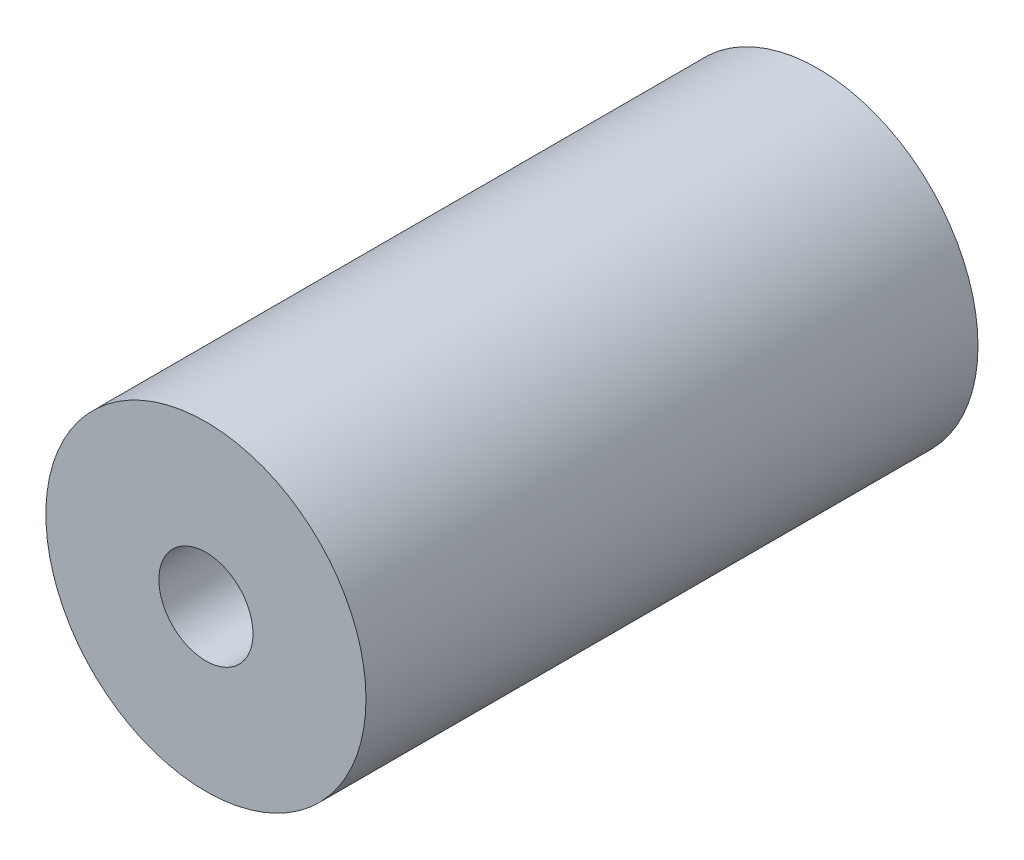
ISO-10303-21;
HEADER;
FILE_DESCRIPTION(('STEP AP214'),'2;1');
FILE_NAME('part.step','',(''),(''),'','','');
FILE_SCHEMA(('AUTOMOTIVE_DESIGN { 1 0 10303 214 1 1 1 1 }'));
ENDSEC;
DATA;
#1=APPLICATION_CONTEXT('core data for automotive mechanical design processes');
#2=APPLICATION_PROTOCOL_DEFINITION('international standard','automotive_design',2000,#1);
#3=PRODUCT_CONTEXT('',#1,'mechanical');
#4=PRODUCT('Part','Part','',(#3));
#5=PRODUCT_RELATED_PRODUCT_CATEGORY('part','',(#4));
#6=PRODUCT_DEFINITION_FORMATION('','',#4);
#7=PRODUCT_DEFINITION_CONTEXT('part definition',#1,'design');
#8=PRODUCT_DEFINITION('design','',#6,#7);
#9=PRODUCT_DEFINITION_SHAPE('','',#8);
#10=(LENGTH_UNIT() NAMED_UNIT(*) SI_UNIT(.MILLI.,.METRE.));
#11=(NAMED_UNIT(*) PLANE_ANGLE_UNIT() SI_UNIT($,.RADIAN.));
#12=(NAMED_UNIT(*) SI_UNIT($,.STERADIAN.) SOLID_ANGLE_UNIT());
#13=UNCERTAINTY_MEASURE_WITH_UNIT(LENGTH_MEASURE(1.E-05),#10,'distance_accuracy_value','');
#14=(GEOMETRIC_REPRESENTATION_CONTEXT(3) GLOBAL_UNCERTAINTY_ASSIGNED_CONTEXT((#13)) GLOBAL_UNIT_ASSIGNED_CONTEXT((#10,
#11,#12)) REPRESENTATION_CONTEXT('',''));
#15=CARTESIAN_POINT('',(0.,0.,0.));
#16=DIRECTION('',(0.,0.,1.));
#17=DIRECTION('',(1.,0.,0.));
#18=AXIS2_PLACEMENT_3D('',#15,#16,#17);
#19=CARTESIAN_POINT('',(0.,0.,65.));
#20=DIRECTION('',(0.,0.,-1.));
#21=DIRECTION('',(-1.,0.,0.));
#22=AXIS2_PLACEMENT_3D('',#19,#20,#21);
#23=CYLINDRICAL_SURFACE('',#22,17.);
#24=CARTESIAN_POINT('',(0.,0.,65.));
#25=DIRECTION('',(0.,0.,1.));
#26=DIRECTION('',(1.,0.,0.));
#27=AXIS2_PLACEMENT_3D('',#24,#25,#26);
#28=CIRCLE('',#27,17.);
#29=CARTESIAN_POINT('',(17.,0.,65.));
#30=VERTEX_POINT('',#29);
#31=EDGE_CURVE('E10',#30,#30,#28,.T.);
#32=ORIENTED_EDGE('',*,*,#31,.F.);
#33=EDGE_LOOP('',(#32));
#34=FACE_BOUND('',#33,.T.);
#35=CARTESIAN_POINT('',(0.,0.,0.));
#36=DIRECTION('',(0.,0.,1.));
#37=DIRECTION('',(1.,0.,0.));
#38=AXIS2_PLACEMENT_3D('',#35,#36,#37);
#39=CIRCLE('',#38,17.);
#40=CARTESIAN_POINT('',(17.,0.,0.));
#41=VERTEX_POINT('',#40);
#42=EDGE_CURVE('E42',#41,#41,#39,.T.);
#43=ORIENTED_EDGE('',*,*,#42,.T.);
#44=EDGE_LOOP('',(#43));
#45=FACE_BOUND('',#44,.T.);
#46=ADVANCED_FACE('F35',(#34,#45),#23,.T.);
#47=CARTESIAN_POINT('',(0.,0.,65.));
#48=DIRECTION('',(0.,0.,1.));
#49=DIRECTION('',(1.,0.,0.));
#50=AXIS2_PLACEMENT_3D('',#47,#48,#49);
#51=PLANE('',#50);
#52=CARTESIAN_POINT('',(0.,0.,65.));
#53=DIRECTION('',(0.,0.,1.));
#54=DIRECTION('',(1.,0.,0.));
#55=AXIS2_PLACEMENT_3D('',#52,#53,#54);
#56=CIRCLE('',#55,5.);
#57=CARTESIAN_POINT('',(5.,0.,65.));
#58=VERTEX_POINT('',#57);
#59=EDGE_CURVE('E48',#58,#58,#56,.T.);
#60=ORIENTED_EDGE('',*,*,#59,.F.);
#61=EDGE_LOOP('',(#60));
#62=FACE_BOUND('',#61,.T.);
#63=ORIENTED_EDGE('',*,*,#31,.T.);
#64=EDGE_LOOP('',(#63));
#65=FACE_BOUND('',#64,.T.);
#66=ADVANCED_FACE('F64',(#62,#65),#51,.T.);
#67=CARTESIAN_POINT('',(0.,0.,0.));
#68=DIRECTION('',(0.,0.,1.));
#69=DIRECTION('',(1.,0.,0.));
#70=AXIS2_PLACEMENT_3D('',#67,#68,#69);
#71=PLANE('',#70);
#72=CARTESIAN_POINT('',(0.,0.,0.));
#73=DIRECTION('',(0.,0.,1.));
#74=DIRECTION('',(1.,0.,0.));
#75=AXIS2_PLACEMENT_3D('',#72,#73,#74);
#76=CIRCLE('',#75,5.);
#77=CARTESIAN_POINT('',(5.,0.,0.));
#78=VERTEX_POINT('',#77);
#79=EDGE_CURVE('E38',#78,#78,#76,.T.);
#80=ORIENTED_EDGE('',*,*,#79,.T.);
#81=EDGE_LOOP('',(#80));
#82=FACE_BOUND('',#81,.T.);
#83=ORIENTED_EDGE('',*,*,#42,.F.);
#84=EDGE_LOOP('',(#83));
#85=FACE_BOUND('',#84,.T.);
#86=ADVANCED_FACE('F55',(#82,#85),#71,.F.);
#87=CARTESIAN_POINT('',(0.,0.,-85.));
#88=DIRECTION('',(0.,0.,1.));
#89=DIRECTION('',(1.,0.,0.));
#90=AXIS2_PLACEMENT_3D('',#87,#88,#89);
#91=CYLINDRICAL_SURFACE('',#90,5.);
#92=ORIENTED_EDGE('',*,*,#59,.T.);
#93=EDGE_LOOP('',(#92));
#94=FACE_BOUND('',#93,.T.);
#95=ORIENTED_EDGE('',*,*,#79,.F.);
#96=EDGE_LOOP('',(#95));
#97=FACE_BOUND('',#96,.T.);
#98=ADVANCED_FACE('F58',(#94,#97),#91,.F.);
#99=CLOSED_SHELL('',(#46,#66,#86,#98));
#100=MANIFOLD_SOLID_BREP('B2',#99);
#101=ADVANCED_BREP_SHAPE_REPRESENTATION('',(#18,#100),#14);
#102=SHAPE_DEFINITION_REPRESENTATION(#9,#101);
ENDSEC;
END-ISO-10303-21;
